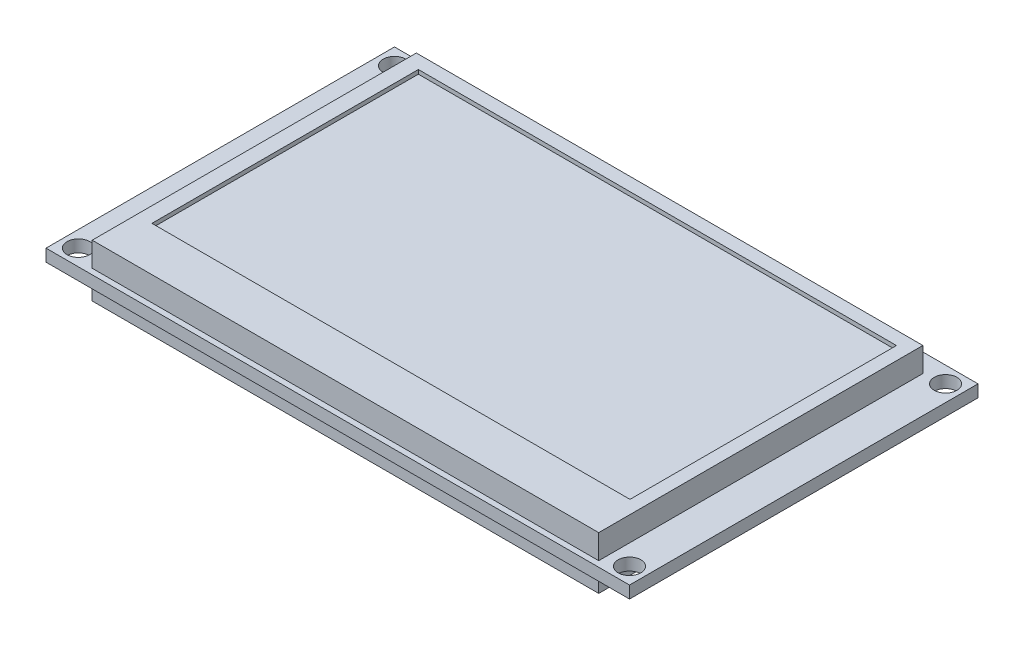
ISO-10303-21;
HEADER;
FILE_DESCRIPTION(('STEP AP214'),'2;1');
FILE_NAME('part.step','',(''),(''),'','','');
FILE_SCHEMA(('AUTOMOTIVE_DESIGN { 1 0 10303 214 1 1 1 1 }'));
ENDSEC;
DATA;
#1=APPLICATION_CONTEXT('core data for automotive mechanical design processes');
#2=APPLICATION_PROTOCOL_DEFINITION('international standard','automotive_design',2000,#1);
#3=PRODUCT_CONTEXT('',#1,'mechanical');
#4=PRODUCT('Part','Part','',(#3));
#5=PRODUCT_RELATED_PRODUCT_CATEGORY('part','',(#4));
#6=PRODUCT_DEFINITION_FORMATION('','',#4);
#7=PRODUCT_DEFINITION_CONTEXT('part definition',#1,'design');
#8=PRODUCT_DEFINITION('design','',#6,#7);
#9=PRODUCT_DEFINITION_SHAPE('','',#8);
#10=(LENGTH_UNIT() NAMED_UNIT(*) SI_UNIT(.MILLI.,.METRE.));
#11=(NAMED_UNIT(*) PLANE_ANGLE_UNIT() SI_UNIT($,.RADIAN.));
#12=(NAMED_UNIT(*) SI_UNIT($,.STERADIAN.) SOLID_ANGLE_UNIT());
#13=UNCERTAINTY_MEASURE_WITH_UNIT(LENGTH_MEASURE(1.E-05),#10,'distance_accuracy_value','');
#14=(GEOMETRIC_REPRESENTATION_CONTEXT(3) GLOBAL_UNCERTAINTY_ASSIGNED_CONTEXT((#13)) GLOBAL_UNIT_ASSIGNED_CONTEXT((#10,
#11,#12)) REPRESENTATION_CONTEXT('',''));
#15=CARTESIAN_POINT('',(0.,0.,0.));
#16=DIRECTION('',(0.,0.,1.));
#17=DIRECTION('',(1.,0.,0.));
#18=AXIS2_PLACEMENT_3D('',#15,#16,#17);
#19=CARTESIAN_POINT('',(0.,1.5,0.));
#20=DIRECTION('',(0.,-1.,0.));
#21=DIRECTION('',(0.,0.,-1.));
#22=AXIS2_PLACEMENT_3D('',#19,#20,#21);
#23=PLANE('',#22);
#24=DIRECTION('',(0.,0.,1.));
#25=VECTOR('',#24,1.);
#26=CARTESIAN_POINT('',(0.,1.5,0.));
#27=LINE('',#26,#25);
#28=CARTESIAN_POINT('',(0.,1.5,-43.));
#29=VERTEX_POINT('',#28);
#30=CARTESIAN_POINT('',(0.,1.5,0.));
#31=VERTEX_POINT('',#30);
#32=EDGE_CURVE('E317',#29,#31,#27,.T.);
#33=ORIENTED_EDGE('',*,*,#32,.T.);
#34=DIRECTION('',(1.,0.,0.));
#35=VECTOR('',#34,1.);
#36=CARTESIAN_POINT('',(0.,1.5,0.));
#37=LINE('',#36,#35);
#38=CARTESIAN_POINT('',(72.,1.5,0.));
#39=VERTEX_POINT('',#38);
#40=EDGE_CURVE('E321',#31,#39,#37,.T.);
#41=ORIENTED_EDGE('',*,*,#40,.T.);
#42=DIRECTION('',(0.,0.,-1.));
#43=VECTOR('',#42,1.);
#44=CARTESIAN_POINT('',(72.,1.5,0.));
#45=LINE('',#44,#43);
#46=CARTESIAN_POINT('',(72.,1.5,-43.));
#47=VERTEX_POINT('',#46);
#48=EDGE_CURVE('E325',#39,#47,#45,.T.);
#49=ORIENTED_EDGE('',*,*,#48,.T.);
#50=DIRECTION('',(-1.,0.,0.));
#51=VECTOR('',#50,1.);
#52=CARTESIAN_POINT('',(0.,1.5,-43.));
#53=LINE('',#52,#51);
#54=EDGE_CURVE('E328',#47,#29,#53,.T.);
#55=ORIENTED_EDGE('',*,*,#54,.T.);
#56=EDGE_LOOP('',(#33,#41,#49,#55));
#57=FACE_BOUND('',#56,.T.);
#58=CARTESIAN_POINT('',(2.,1.5,-41.));
#59=DIRECTION('',(0.,1.,0.));
#60=DIRECTION('',(0.,0.,1.));
#61=AXIS2_PLACEMENT_3D('',#58,#59,#60);
#62=CIRCLE('',#61,1.4);
#63=CARTESIAN_POINT('',(2.,1.5,-39.6));
#64=VERTEX_POINT('',#63);
#65=EDGE_CURVE('E297',#64,#64,#62,.T.);
#66=ORIENTED_EDGE('',*,*,#65,.F.);
#67=EDGE_LOOP('',(#66));
#68=FACE_BOUND('',#67,.T.);
#69=CARTESIAN_POINT('',(70.,1.5,-2.));
#70=DIRECTION('',(0.,1.,0.));
#71=DIRECTION('',(0.,0.,1.));
#72=AXIS2_PLACEMENT_3D('',#69,#70,#71);
#73=CIRCLE('',#72,1.4);
#74=CARTESIAN_POINT('',(70.,1.5,-0.599999999999997));
#75=VERTEX_POINT('',#74);
#76=EDGE_CURVE('E285',#75,#75,#73,.T.);
#77=ORIENTED_EDGE('',*,*,#76,.F.);
#78=EDGE_LOOP('',(#77));
#79=FACE_BOUND('',#78,.T.);
#80=CARTESIAN_POINT('',(2.,1.5,-2.));
#81=DIRECTION('',(0.,1.,0.));
#82=DIRECTION('',(0.,0.,1.));
#83=AXIS2_PLACEMENT_3D('',#80,#81,#82);
#84=CIRCLE('',#83,1.4);
#85=CARTESIAN_POINT('',(2.,1.5,-0.6));
#86=VERTEX_POINT('',#85);
#87=EDGE_CURVE('E302',#86,#86,#84,.T.);
#88=ORIENTED_EDGE('',*,*,#87,.F.);
#89=EDGE_LOOP('',(#88));
#90=FACE_BOUND('',#89,.T.);
#91=CARTESIAN_POINT('',(70.,1.5,-41.));
#92=DIRECTION('',(0.,1.,0.));
#93=DIRECTION('',(0.,0.,1.));
#94=AXIS2_PLACEMENT_3D('',#91,#92,#93);
#95=CIRCLE('',#94,1.4);
#96=CARTESIAN_POINT('',(70.,1.5,-39.6));
#97=VERTEX_POINT('',#96);
#98=EDGE_CURVE('E293',#97,#97,#95,.T.);
#99=ORIENTED_EDGE('',*,*,#98,.F.);
#100=EDGE_LOOP('',(#99));
#101=FACE_BOUND('',#100,.T.);
#102=DIRECTION('',(0.,0.,1.));
#103=VECTOR('',#102,1.);
#104=CARTESIAN_POINT('',(5.,1.5,-40.7));
#105=LINE('',#104,#103);
#106=CARTESIAN_POINT('',(5.,1.5,-40.7));
#107=VERTEX_POINT('',#106);
#108=CARTESIAN_POINT('',(5.00000000000001,1.5,-0.699999999999999));
#109=VERTEX_POINT('',#108);
#110=EDGE_CURVE('E228',#107,#109,#105,.T.);
#111=ORIENTED_EDGE('',*,*,#110,.F.);
#112=DIRECTION('',(-1.,0.,0.));
#113=VECTOR('',#112,1.);
#114=CARTESIAN_POINT('',(5.,1.5,-40.7));
#115=LINE('',#114,#113);
#116=CARTESIAN_POINT('',(67.5,1.5,-40.7));
#117=VERTEX_POINT('',#116);
#118=EDGE_CURVE('E245',#117,#107,#115,.T.);
#119=ORIENTED_EDGE('',*,*,#118,.F.);
#120=DIRECTION('',(0.,0.,-1.));
#121=VECTOR('',#120,1.);
#122=CARTESIAN_POINT('',(67.5,1.5,-40.7));
#123=LINE('',#122,#121);
#124=CARTESIAN_POINT('',(67.5,1.5,-0.699999999999999));
#125=VERTEX_POINT('',#124);
#126=EDGE_CURVE('E262',#125,#117,#123,.T.);
#127=ORIENTED_EDGE('',*,*,#126,.F.);
#128=DIRECTION('',(1.,0.,0.));
#129=VECTOR('',#128,1.);
#130=CARTESIAN_POINT('',(5.00000000000001,1.5,-0.699999999999999));
#131=LINE('',#130,#129);
#132=EDGE_CURVE('E258',#109,#125,#131,.T.);
#133=ORIENTED_EDGE('',*,*,#132,.F.);
#134=EDGE_LOOP('',(#111,#119,#127,#133));
#135=FACE_BOUND('',#134,.T.);
#136=ADVANCED_FACE('F45',(#57,#68,#79,#90,#101,#135),#23,.F.);
#137=CARTESIAN_POINT('',(0.,1.5,0.));
#138=DIRECTION('',(1.,0.,0.));
#139=DIRECTION('',(0.,0.,-1.));
#140=AXIS2_PLACEMENT_3D('',#137,#138,#139);
#141=PLANE('',#140);
#142=DIRECTION('',(0.,0.,1.));
#143=VECTOR('',#142,1.);
#144=CARTESIAN_POINT('',(0.,0.,0.));
#145=LINE('',#144,#143);
#146=CARTESIAN_POINT('',(0.,0.,-43.));
#147=VERTEX_POINT('',#146);
#148=CARTESIAN_POINT('',(0.,0.,0.));
#149=VERTEX_POINT('',#148);
#150=EDGE_CURVE('E313',#147,#149,#145,.T.);
#151=ORIENTED_EDGE('',*,*,#150,.T.);
#152=DIRECTION('',(0.,-1.,0.));
#153=VECTOR('',#152,1.);
#154=CARTESIAN_POINT('',(0.,1.5,0.));
#155=LINE('',#154,#153);
#156=EDGE_CURVE('E354',#31,#149,#155,.T.);
#157=ORIENTED_EDGE('',*,*,#156,.F.);
#158=ORIENTED_EDGE('',*,*,#32,.F.);
#159=DIRECTION('',(0.,-1.,0.));
#160=VECTOR('',#159,1.);
#161=CARTESIAN_POINT('',(0.,1.5,-43.));
#162=LINE('',#161,#160);
#163=EDGE_CURVE('E331',#29,#147,#162,.T.);
#164=ORIENTED_EDGE('',*,*,#163,.T.);
#165=EDGE_LOOP('',(#151,#157,#158,#164));
#166=FACE_BOUND('',#165,.T.);
#167=ADVANCED_FACE('F47',(#166),#141,.F.);
#168=CARTESIAN_POINT('',(0.,1.5,0.));
#169=DIRECTION('',(0.,0.,-1.));
#170=DIRECTION('',(-1.,0.,0.));
#171=AXIS2_PLACEMENT_3D('',#168,#169,#170);
#172=PLANE('',#171);
#173=DIRECTION('',(1.,0.,0.));
#174=VECTOR('',#173,1.);
#175=CARTESIAN_POINT('',(0.,0.,0.));
#176=LINE('',#175,#174);
#177=CARTESIAN_POINT('',(72.,0.,0.));
#178=VERTEX_POINT('',#177);
#179=EDGE_CURVE('E335',#149,#178,#176,.T.);
#180=ORIENTED_EDGE('',*,*,#179,.T.);
#181=DIRECTION('',(0.,-1.,0.));
#182=VECTOR('',#181,1.);
#183=CARTESIAN_POINT('',(72.,1.5,0.));
#184=LINE('',#183,#182);
#185=EDGE_CURVE('E350',#39,#178,#184,.T.);
#186=ORIENTED_EDGE('',*,*,#185,.F.);
#187=ORIENTED_EDGE('',*,*,#40,.F.);
#188=ORIENTED_EDGE('',*,*,#156,.T.);
#189=EDGE_LOOP('',(#180,#186,#187,#188));
#190=FACE_BOUND('',#189,.T.);
#191=ADVANCED_FACE('F399',(#190),#172,.F.);
#192=CARTESIAN_POINT('',(72.,1.5,0.));
#193=DIRECTION('',(-1.,0.,0.));
#194=DIRECTION('',(0.,0.,1.));
#195=AXIS2_PLACEMENT_3D('',#192,#193,#194);
#196=PLANE('',#195);
#197=DIRECTION('',(0.,0.,-1.));
#198=VECTOR('',#197,1.);
#199=CARTESIAN_POINT('',(72.,0.,0.));
#200=LINE('',#199,#198);
#201=CARTESIAN_POINT('',(72.,0.,-43.));
#202=VERTEX_POINT('',#201);
#203=EDGE_CURVE('E338',#178,#202,#200,.T.);
#204=ORIENTED_EDGE('',*,*,#203,.T.);
#205=DIRECTION('',(0.,-1.,0.));
#206=VECTOR('',#205,1.);
#207=CARTESIAN_POINT('',(72.,1.5,-43.));
#208=LINE('',#207,#206);
#209=EDGE_CURVE('E346',#47,#202,#208,.T.);
#210=ORIENTED_EDGE('',*,*,#209,.F.);
#211=ORIENTED_EDGE('',*,*,#48,.F.);
#212=ORIENTED_EDGE('',*,*,#185,.T.);
#213=EDGE_LOOP('',(#204,#210,#211,#212));
#214=FACE_BOUND('',#213,.T.);
#215=ADVANCED_FACE('F411',(#214),#196,.F.);
#216=CARTESIAN_POINT('',(0.,1.5,-43.));
#217=DIRECTION('',(0.,0.,1.));
#218=DIRECTION('',(1.,0.,0.));
#219=AXIS2_PLACEMENT_3D('',#216,#217,#218);
#220=PLANE('',#219);
#221=DIRECTION('',(-1.,0.,0.));
#222=VECTOR('',#221,1.);
#223=CARTESIAN_POINT('',(0.,0.,-43.));
#224=LINE('',#223,#222);
#225=EDGE_CURVE('E322',#202,#147,#224,.T.);
#226=ORIENTED_EDGE('',*,*,#225,.T.);
#227=ORIENTED_EDGE('',*,*,#163,.F.);
#228=ORIENTED_EDGE('',*,*,#54,.F.);
#229=ORIENTED_EDGE('',*,*,#209,.T.);
#230=EDGE_LOOP('',(#226,#227,#228,#229));
#231=FACE_BOUND('',#230,.T.);
#232=ADVANCED_FACE('F408',(#231),#220,.F.);
#233=CARTESIAN_POINT('',(0.,0.,0.));
#234=DIRECTION('',(0.,-1.,0.));
#235=DIRECTION('',(0.,0.,-1.));
#236=AXIS2_PLACEMENT_3D('',#233,#234,#235);
#237=PLANE('',#236);
#238=DIRECTION('',(0.,0.,-1.));
#239=VECTOR('',#238,1.);
#240=CARTESIAN_POINT('',(5.00000000000001,0.,0.));
#241=LINE('',#240,#239);
#242=CARTESIAN_POINT('',(5.00000000000001,0.,-0.699999999999999));
#243=VERTEX_POINT('',#242);
#244=CARTESIAN_POINT('',(5.,0.,-40.7));
#245=VERTEX_POINT('',#244);
#246=EDGE_CURVE('E11',#243,#245,#241,.T.);
#247=ORIENTED_EDGE('',*,*,#246,.F.);
#248=DIRECTION('',(-1.,0.,0.));
#249=VECTOR('',#248,1.);
#250=CARTESIAN_POINT('',(0.,0.,-0.699999999999999));
#251=LINE('',#250,#249);
#252=CARTESIAN_POINT('',(67.5,0.,-0.699999999999999));
#253=VERTEX_POINT('',#252);
#254=EDGE_CURVE('E358',#253,#243,#251,.T.);
#255=ORIENTED_EDGE('',*,*,#254,.F.);
#256=DIRECTION('',(0.,0.,1.));
#257=VECTOR('',#256,1.);
#258=CARTESIAN_POINT('',(67.5,0.,0.));
#259=LINE('',#258,#257);
#260=CARTESIAN_POINT('',(67.5,0.,-40.7));
#261=VERTEX_POINT('',#260);
#262=EDGE_CURVE('E362',#261,#253,#259,.T.);
#263=ORIENTED_EDGE('',*,*,#262,.F.);
#264=DIRECTION('',(1.,0.,0.));
#265=VECTOR('',#264,1.);
#266=CARTESIAN_POINT('',(0.,0.,-40.7));
#267=LINE('',#266,#265);
#268=EDGE_CURVE('E54',#245,#261,#267,.T.);
#269=ORIENTED_EDGE('',*,*,#268,.F.);
#270=EDGE_LOOP('',(#247,#255,#263,#269));
#271=FACE_BOUND('',#270,.T.);
#272=CARTESIAN_POINT('',(70.,0.,-41.));
#273=DIRECTION('',(0.,1.,0.));
#274=DIRECTION('',(0.,0.,1.));
#275=AXIS2_PLACEMENT_3D('',#272,#273,#274);
#276=CIRCLE('',#275,1.4);
#277=CARTESIAN_POINT('',(70.,0.,-39.6));
#278=VERTEX_POINT('',#277);
#279=EDGE_CURVE('E298',#278,#278,#276,.T.);
#280=ORIENTED_EDGE('',*,*,#279,.T.);
#281=EDGE_LOOP('',(#280));
#282=FACE_BOUND('',#281,.T.);
#283=CARTESIAN_POINT('',(2.,0.,-2.));
#284=DIRECTION('',(0.,1.,0.));
#285=DIRECTION('',(0.,0.,1.));
#286=AXIS2_PLACEMENT_3D('',#283,#284,#285);
#287=CIRCLE('',#286,1.4);
#288=CARTESIAN_POINT('',(2.,0.,-0.6));
#289=VERTEX_POINT('',#288);
#290=EDGE_CURVE('E289',#289,#289,#287,.T.);
#291=ORIENTED_EDGE('',*,*,#290,.T.);
#292=EDGE_LOOP('',(#291));
#293=FACE_BOUND('',#292,.T.);
#294=CARTESIAN_POINT('',(70.,0.,-2.));
#295=DIRECTION('',(0.,1.,0.));
#296=DIRECTION('',(0.,0.,1.));
#297=AXIS2_PLACEMENT_3D('',#294,#295,#296);
#298=CIRCLE('',#297,1.4);
#299=CARTESIAN_POINT('',(70.,0.,-0.599999999999997));
#300=VERTEX_POINT('',#299);
#301=EDGE_CURVE('E284',#300,#300,#298,.T.);
#302=ORIENTED_EDGE('',*,*,#301,.T.);
#303=EDGE_LOOP('',(#302));
#304=FACE_BOUND('',#303,.T.);
#305=CARTESIAN_POINT('',(2.,0.,-41.));
#306=DIRECTION('',(0.,1.,0.));
#307=DIRECTION('',(0.,0.,1.));
#308=AXIS2_PLACEMENT_3D('',#305,#306,#307);
#309=CIRCLE('',#308,1.4);
#310=CARTESIAN_POINT('',(2.,0.,-39.6));
#311=VERTEX_POINT('',#310);
#312=EDGE_CURVE('E309',#311,#311,#309,.T.);
#313=ORIENTED_EDGE('',*,*,#312,.T.);
#314=EDGE_LOOP('',(#313));
#315=FACE_BOUND('',#314,.T.);
#316=ORIENTED_EDGE('',*,*,#150,.F.);
#317=ORIENTED_EDGE('',*,*,#225,.F.);
#318=ORIENTED_EDGE('',*,*,#203,.F.);
#319=ORIENTED_EDGE('',*,*,#179,.F.);
#320=EDGE_LOOP('',(#316,#317,#318,#319));
#321=FACE_BOUND('',#320,.T.);
#322=ADVANCED_FACE('F378',(#271,#282,#293,#304,#315,#321),#237,.T.);
#323=CARTESIAN_POINT('',(2.,0.,-41.));
#324=DIRECTION('',(0.,1.,0.));
#325=DIRECTION('',(0.,0.,1.));
#326=AXIS2_PLACEMENT_3D('',#323,#324,#325);
#327=CYLINDRICAL_SURFACE('',#326,1.4);
#328=ORIENTED_EDGE('',*,*,#312,.F.);
#329=EDGE_LOOP('',(#328));
#330=FACE_BOUND('',#329,.T.);
#331=ORIENTED_EDGE('',*,*,#65,.T.);
#332=EDGE_LOOP('',(#331));
#333=FACE_BOUND('',#332,.T.);
#334=ADVANCED_FACE('F404',(#330,#333),#327,.F.);
#335=CARTESIAN_POINT('',(70.,0.,-2.));
#336=DIRECTION('',(0.,1.,0.));
#337=DIRECTION('',(0.,0.,1.));
#338=AXIS2_PLACEMENT_3D('',#335,#336,#337);
#339=CYLINDRICAL_SURFACE('',#338,1.4);
#340=ORIENTED_EDGE('',*,*,#301,.F.);
#341=EDGE_LOOP('',(#340));
#342=FACE_BOUND('',#341,.T.);
#343=ORIENTED_EDGE('',*,*,#76,.T.);
#344=EDGE_LOOP('',(#343));
#345=FACE_BOUND('',#344,.T.);
#346=ADVANCED_FACE('F450',(#342,#345),#339,.F.);
#347=CARTESIAN_POINT('',(2.,0.,-2.));
#348=DIRECTION('',(0.,1.,0.));
#349=DIRECTION('',(0.,0.,1.));
#350=AXIS2_PLACEMENT_3D('',#347,#348,#349);
#351=CYLINDRICAL_SURFACE('',#350,1.4);
#352=ORIENTED_EDGE('',*,*,#290,.F.);
#353=EDGE_LOOP('',(#352));
#354=FACE_BOUND('',#353,.T.);
#355=ORIENTED_EDGE('',*,*,#87,.T.);
#356=EDGE_LOOP('',(#355));
#357=FACE_BOUND('',#356,.T.);
#358=ADVANCED_FACE('F458',(#354,#357),#351,.F.);
#359=CARTESIAN_POINT('',(70.,0.,-41.));
#360=DIRECTION('',(0.,1.,0.));
#361=DIRECTION('',(0.,0.,1.));
#362=AXIS2_PLACEMENT_3D('',#359,#360,#361);
#363=CYLINDRICAL_SURFACE('',#362,1.4);
#364=ORIENTED_EDGE('',*,*,#279,.F.);
#365=EDGE_LOOP('',(#364));
#366=FACE_BOUND('',#365,.T.);
#367=ORIENTED_EDGE('',*,*,#98,.T.);
#368=EDGE_LOOP('',(#367));
#369=FACE_BOUND('',#368,.T.);
#370=ADVANCED_FACE('F466',(#366,#369),#363,.F.);
#371=CARTESIAN_POINT('',(5.,4.5,-40.7));
#372=DIRECTION('',(1.,0.,0.));
#373=DIRECTION('',(0.,0.,-1.));
#374=AXIS2_PLACEMENT_3D('',#371,#372,#373);
#375=PLANE('',#374);
#376=ORIENTED_EDGE('',*,*,#110,.T.);
#377=DIRECTION('',(0.,-1.,0.));
#378=VECTOR('',#377,1.);
#379=CARTESIAN_POINT('',(5.00000000000001,4.5,-0.699999999999999));
#380=LINE('',#379,#378);
#381=CARTESIAN_POINT('',(5.00000000000001,4.5,-0.699999999999999));
#382=VERTEX_POINT('',#381);
#383=EDGE_CURVE('E280',#382,#109,#380,.T.);
#384=ORIENTED_EDGE('',*,*,#383,.F.);
#385=DIRECTION('',(0.,0.,1.));
#386=VECTOR('',#385,1.);
#387=CARTESIAN_POINT('',(5.,4.5,-40.7));
#388=LINE('',#387,#386);
#389=CARTESIAN_POINT('',(5.,4.5,-40.7));
#390=VERTEX_POINT('',#389);
#391=EDGE_CURVE('E240',#390,#382,#388,.T.);
#392=ORIENTED_EDGE('',*,*,#391,.F.);
#393=DIRECTION('',(0.,-1.,0.));
#394=VECTOR('',#393,1.);
#395=CARTESIAN_POINT('',(5.,4.5,-40.7));
#396=LINE('',#395,#394);
#397=EDGE_CURVE('E254',#390,#107,#396,.T.);
#398=ORIENTED_EDGE('',*,*,#397,.T.);
#399=EDGE_LOOP('',(#376,#384,#392,#398));
#400=FACE_BOUND('',#399,.T.);
#401=ADVANCED_FACE('F473',(#400),#375,.F.);
#402=CARTESIAN_POINT('',(5.00000000000001,4.5,-0.699999999999999));
#403=DIRECTION('',(0.,0.,-1.));
#404=DIRECTION('',(-1.,0.,0.));
#405=AXIS2_PLACEMENT_3D('',#402,#403,#404);
#406=PLANE('',#405);
#407=ORIENTED_EDGE('',*,*,#132,.T.);
#408=DIRECTION('',(0.,-1.,0.));
#409=VECTOR('',#408,1.);
#410=CARTESIAN_POINT('',(67.5,4.5,-0.699999999999999));
#411=LINE('',#410,#409);
#412=CARTESIAN_POINT('',(67.5,4.5,-0.699999999999999));
#413=VERTEX_POINT('',#412);
#414=EDGE_CURVE('E276',#413,#125,#411,.T.);
#415=ORIENTED_EDGE('',*,*,#414,.F.);
#416=DIRECTION('',(1.,0.,0.));
#417=VECTOR('',#416,1.);
#418=CARTESIAN_POINT('',(5.00000000000001,4.5,-0.699999999999999));
#419=LINE('',#418,#417);
#420=EDGE_CURVE('E244',#382,#413,#419,.T.);
#421=ORIENTED_EDGE('',*,*,#420,.F.);
#422=ORIENTED_EDGE('',*,*,#383,.T.);
#423=EDGE_LOOP('',(#407,#415,#421,#422));
#424=FACE_BOUND('',#423,.T.);
#425=ADVANCED_FACE('F489',(#424),#406,.F.);
#426=CARTESIAN_POINT('',(67.5,4.5,-40.7));
#427=DIRECTION('',(-1.,0.,0.));
#428=DIRECTION('',(0.,0.,1.));
#429=AXIS2_PLACEMENT_3D('',#426,#427,#428);
#430=PLANE('',#429);
#431=ORIENTED_EDGE('',*,*,#126,.T.);
#432=DIRECTION('',(0.,-1.,0.));
#433=VECTOR('',#432,1.);
#434=CARTESIAN_POINT('',(67.5,4.5,-40.7));
#435=LINE('',#434,#433);
#436=CARTESIAN_POINT('',(67.5,4.5,-40.7));
#437=VERTEX_POINT('',#436);
#438=EDGE_CURVE('E272',#437,#117,#435,.T.);
#439=ORIENTED_EDGE('',*,*,#438,.F.);
#440=DIRECTION('',(0.,0.,-1.));
#441=VECTOR('',#440,1.);
#442=CARTESIAN_POINT('',(67.5,4.5,-40.7));
#443=LINE('',#442,#441);
#444=EDGE_CURVE('E248',#413,#437,#443,.T.);
#445=ORIENTED_EDGE('',*,*,#444,.F.);
#446=ORIENTED_EDGE('',*,*,#414,.T.);
#447=EDGE_LOOP('',(#431,#439,#445,#446));
#448=FACE_BOUND('',#447,.T.);
#449=ADVANCED_FACE('F499',(#448),#430,.F.);
#450=CARTESIAN_POINT('',(5.,4.5,-40.7));
#451=DIRECTION('',(0.,0.,1.));
#452=DIRECTION('',(1.,0.,0.));
#453=AXIS2_PLACEMENT_3D('',#450,#451,#452);
#454=PLANE('',#453);
#455=ORIENTED_EDGE('',*,*,#118,.T.);
#456=ORIENTED_EDGE('',*,*,#397,.F.);
#457=DIRECTION('',(-1.,0.,0.));
#458=VECTOR('',#457,1.);
#459=CARTESIAN_POINT('',(5.,4.5,-40.7));
#460=LINE('',#459,#458);
#461=EDGE_CURVE('E251',#437,#390,#460,.T.);
#462=ORIENTED_EDGE('',*,*,#461,.F.);
#463=ORIENTED_EDGE('',*,*,#438,.T.);
#464=EDGE_LOOP('',(#455,#456,#462,#463));
#465=FACE_BOUND('',#464,.T.);
#466=ADVANCED_FACE('F509',(#465),#454,.F.);
#467=CARTESIAN_POINT('',(0.,4.5,0.));
#468=DIRECTION('',(0.,1.,0.));
#469=DIRECTION('',(0.,0.,1.));
#470=AXIS2_PLACEMENT_3D('',#467,#468,#469);
#471=PLANE('',#470);
#472=DIRECTION('',(0.,0.,1.));
#473=VECTOR('',#472,1.);
#474=CARTESIAN_POINT('',(6.8850404711753,4.5,-39.0622264773516));
#475=LINE('',#474,#473);
#476=CARTESIAN_POINT('',(6.8850404711753,4.5,-39.0622264773516));
#477=VERTEX_POINT('',#476);
#478=CARTESIAN_POINT('',(6.8850404711753,4.5,-6.182699227718));
#479=VERTEX_POINT('',#478);
#480=EDGE_CURVE('E61',#477,#479,#475,.T.);
#481=ORIENTED_EDGE('',*,*,#480,.F.);
#482=DIRECTION('',(-1.,0.,0.));
#483=VECTOR('',#482,1.);
#484=CARTESIAN_POINT('',(6.8850404711753,4.5,-39.0622264773516));
#485=LINE('',#484,#483);
#486=CARTESIAN_POINT('',(65.8747805366944,4.5,-39.0622264773516));
#487=VERTEX_POINT('',#486);
#488=EDGE_CURVE('E180',#487,#477,#485,.T.);
#489=ORIENTED_EDGE('',*,*,#488,.F.);
#490=DIRECTION('',(0.,0.,-1.));
#491=VECTOR('',#490,1.);
#492=CARTESIAN_POINT('',(65.8747805366944,4.5,-39.0622264773516));
#493=LINE('',#492,#491);
#494=CARTESIAN_POINT('',(65.8747805366944,4.5,-6.182699227718));
#495=VERTEX_POINT('',#494);
#496=EDGE_CURVE('E184',#495,#487,#493,.T.);
#497=ORIENTED_EDGE('',*,*,#496,.F.);
#498=DIRECTION('',(1.,0.,0.));
#499=VECTOR('',#498,1.);
#500=CARTESIAN_POINT('',(6.8850404711753,4.5,-6.182699227718));
#501=LINE('',#500,#499);
#502=EDGE_CURVE('E193',#479,#495,#501,.T.);
#503=ORIENTED_EDGE('',*,*,#502,.F.);
#504=EDGE_LOOP('',(#481,#489,#497,#503));
#505=FACE_BOUND('',#504,.T.);
#506=ORIENTED_EDGE('',*,*,#391,.T.);
#507=ORIENTED_EDGE('',*,*,#420,.T.);
#508=ORIENTED_EDGE('',*,*,#444,.T.);
#509=ORIENTED_EDGE('',*,*,#461,.T.);
#510=EDGE_LOOP('',(#506,#507,#508,#509));
#511=FACE_BOUND('',#510,.T.);
#512=ADVANCED_FACE('F519',(#505,#511),#471,.T.);
#513=CARTESIAN_POINT('',(5.,-2.,-40.7));
#514=DIRECTION('',(-1.,0.,0.));
#515=DIRECTION('',(0.,0.,1.));
#516=AXIS2_PLACEMENT_3D('',#513,#514,#515);
#517=PLANE('',#516);
#518=DIRECTION('',(0.,1.,0.));
#519=VECTOR('',#518,1.);
#520=CARTESIAN_POINT('',(5.00000000000001,-2.,-0.699999999999999));
#521=LINE('',#520,#519);
#522=CARTESIAN_POINT('',(5.00000000000001,-2.,-0.699999999999999));
#523=VERTEX_POINT('',#522);
#524=EDGE_CURVE('E223',#523,#243,#521,.T.);
#525=ORIENTED_EDGE('',*,*,#524,.T.);
#526=ORIENTED_EDGE('',*,*,#246,.T.);
#527=DIRECTION('',(0.,1.,0.));
#528=VECTOR('',#527,1.);
#529=CARTESIAN_POINT('',(5.,-2.,-40.7));
#530=LINE('',#529,#528);
#531=CARTESIAN_POINT('',(5.,-2.,-40.7));
#532=VERTEX_POINT('',#531);
#533=EDGE_CURVE('E224',#532,#245,#530,.T.);
#534=ORIENTED_EDGE('',*,*,#533,.F.);
#535=DIRECTION('',(0.,0.,1.));
#536=VECTOR('',#535,1.);
#537=CARTESIAN_POINT('',(5.,-2.,-40.7));
#538=LINE('',#537,#536);
#539=EDGE_CURVE('E202',#532,#523,#538,.T.);
#540=ORIENTED_EDGE('',*,*,#539,.T.);
#541=EDGE_LOOP('',(#525,#526,#534,#540));
#542=FACE_BOUND('',#541,.T.);
#543=ADVANCED_FACE('F377',(#542),#517,.T.);
#544=CARTESIAN_POINT('',(5.,-2.,-40.7));
#545=DIRECTION('',(0.,0.,-1.));
#546=DIRECTION('',(-1.,0.,0.));
#547=AXIS2_PLACEMENT_3D('',#544,#545,#546);
#548=PLANE('',#547);
#549=ORIENTED_EDGE('',*,*,#533,.T.);
#550=ORIENTED_EDGE('',*,*,#268,.T.);
#551=DIRECTION('',(0.,1.,0.));
#552=VECTOR('',#551,1.);
#553=CARTESIAN_POINT('',(67.5,-2.,-40.7));
#554=LINE('',#553,#552);
#555=CARTESIAN_POINT('',(67.5,-2.,-40.7));
#556=VERTEX_POINT('',#555);
#557=EDGE_CURVE('E229',#556,#261,#554,.T.);
#558=ORIENTED_EDGE('',*,*,#557,.F.);
#559=DIRECTION('',(-1.,0.,0.));
#560=VECTOR('',#559,1.);
#561=CARTESIAN_POINT('',(5.,-2.,-40.7));
#562=LINE('',#561,#560);
#563=EDGE_CURVE('E219',#556,#532,#562,.T.);
#564=ORIENTED_EDGE('',*,*,#563,.T.);
#565=EDGE_LOOP('',(#549,#550,#558,#564));
#566=FACE_BOUND('',#565,.T.);
#567=ADVANCED_FACE('F367',(#566),#548,.T.);
#568=CARTESIAN_POINT('',(67.5,-2.,-40.7));
#569=DIRECTION('',(1.,0.,0.));
#570=DIRECTION('',(0.,0.,-1.));
#571=AXIS2_PLACEMENT_3D('',#568,#569,#570);
#572=PLANE('',#571);
#573=ORIENTED_EDGE('',*,*,#557,.T.);
#574=ORIENTED_EDGE('',*,*,#262,.T.);
#575=DIRECTION('',(0.,1.,0.));
#576=VECTOR('',#575,1.);
#577=CARTESIAN_POINT('',(67.5,-2.,-0.699999999999999));
#578=LINE('',#577,#576);
#579=CARTESIAN_POINT('',(67.5,-2.,-0.699999999999999));
#580=VERTEX_POINT('',#579);
#581=EDGE_CURVE('E233',#580,#253,#578,.T.);
#582=ORIENTED_EDGE('',*,*,#581,.F.);
#583=DIRECTION('',(0.,0.,-1.));
#584=VECTOR('',#583,1.);
#585=CARTESIAN_POINT('',(67.5,-2.,-40.7));
#586=LINE('',#585,#584);
#587=EDGE_CURVE('E215',#580,#556,#586,.T.);
#588=ORIENTED_EDGE('',*,*,#587,.T.);
#589=EDGE_LOOP('',(#573,#574,#582,#588));
#590=FACE_BOUND('',#589,.T.);
#591=ADVANCED_FACE('F369',(#590),#572,.T.);
#592=CARTESIAN_POINT('',(5.00000000000001,-2.,-0.699999999999999));
#593=DIRECTION('',(0.,0.,1.));
#594=DIRECTION('',(1.,0.,0.));
#595=AXIS2_PLACEMENT_3D('',#592,#593,#594);
#596=PLANE('',#595);
#597=ORIENTED_EDGE('',*,*,#581,.T.);
#598=ORIENTED_EDGE('',*,*,#254,.T.);
#599=ORIENTED_EDGE('',*,*,#524,.F.);
#600=DIRECTION('',(1.,0.,0.));
#601=VECTOR('',#600,1.);
#602=CARTESIAN_POINT('',(5.00000000000001,-2.,-0.699999999999999));
#603=LINE('',#602,#601);
#604=EDGE_CURVE('E211',#523,#580,#603,.T.);
#605=ORIENTED_EDGE('',*,*,#604,.T.);
#606=EDGE_LOOP('',(#597,#598,#599,#605));
#607=FACE_BOUND('',#606,.T.);
#608=ADVANCED_FACE('F381',(#607),#596,.T.);
#609=CARTESIAN_POINT('',(0.,-2.,0.));
#610=DIRECTION('',(0.,1.,0.));
#611=DIRECTION('',(0.,0.,1.));
#612=AXIS2_PLACEMENT_3D('',#609,#610,#611);
#613=PLANE('',#612);
#614=ORIENTED_EDGE('',*,*,#539,.F.);
#615=ORIENTED_EDGE('',*,*,#563,.F.);
#616=ORIENTED_EDGE('',*,*,#587,.F.);
#617=ORIENTED_EDGE('',*,*,#604,.F.);
#618=EDGE_LOOP('',(#614,#615,#616,#617));
#619=FACE_BOUND('',#618,.T.);
#620=ADVANCED_FACE('F375',(#619),#613,.F.);
#621=CARTESIAN_POINT('',(6.8850404711753,4.,-39.0622264773516));
#622=DIRECTION('',(-1.,0.,0.));
#623=DIRECTION('',(0.,0.,1.));
#624=AXIS2_PLACEMENT_3D('',#621,#622,#623);
#625=PLANE('',#624);
#626=ORIENTED_EDGE('',*,*,#480,.T.);
#627=DIRECTION('',(0.,1.,0.));
#628=VECTOR('',#627,1.);
#629=CARTESIAN_POINT('',(6.8850404711753,4.,-6.182699227718));
#630=LINE('',#629,#628);
#631=CARTESIAN_POINT('',(6.8850404711753,4.,-6.182699227718));
#632=VERTEX_POINT('',#631);
#633=EDGE_CURVE('E155',#632,#479,#630,.T.);
#634=ORIENTED_EDGE('',*,*,#633,.F.);
#635=DIRECTION('',(0.,0.,1.));
#636=VECTOR('',#635,1.);
#637=CARTESIAN_POINT('',(6.8850404711753,4.,-39.0622264773516));
#638=LINE('',#637,#636);
#639=CARTESIAN_POINT('',(6.8850404711753,4.,-39.0622264773516));
#640=VERTEX_POINT('',#639);
#641=EDGE_CURVE('E159',#640,#632,#638,.T.);
#642=ORIENTED_EDGE('',*,*,#641,.F.);
#643=DIRECTION('',(0.,1.,0.));
#644=VECTOR('',#643,1.);
#645=CARTESIAN_POINT('',(6.8850404711753,4.,-39.0622264773516));
#646=LINE('',#645,#644);
#647=EDGE_CURVE('E199',#640,#477,#646,.T.);
#648=ORIENTED_EDGE('',*,*,#647,.T.);
#649=EDGE_LOOP('',(#626,#634,#642,#648));
#650=FACE_BOUND('',#649,.T.);
#651=ADVANCED_FACE('F157',(#650),#625,.F.);
#652=CARTESIAN_POINT('',(6.8850404711753,4.,-39.0622264773516));
#653=DIRECTION('',(0.,0.,-1.));
#654=DIRECTION('',(-1.,0.,0.));
#655=AXIS2_PLACEMENT_3D('',#652,#653,#654);
#656=PLANE('',#655);
#657=ORIENTED_EDGE('',*,*,#488,.T.);
#658=ORIENTED_EDGE('',*,*,#647,.F.);
#659=DIRECTION('',(-1.,0.,0.));
#660=VECTOR('',#659,1.);
#661=CARTESIAN_POINT('',(6.8850404711753,4.,-39.0622264773516));
#662=LINE('',#661,#660);
#663=CARTESIAN_POINT('',(65.8747805366944,4.,-39.0622264773516));
#664=VERTEX_POINT('',#663);
#665=EDGE_CURVE('E166',#664,#640,#662,.T.);
#666=ORIENTED_EDGE('',*,*,#665,.F.);
#667=DIRECTION('',(0.,1.,0.));
#668=VECTOR('',#667,1.);
#669=CARTESIAN_POINT('',(65.8747805366944,4.,-39.0622264773516));
#670=LINE('',#669,#668);
#671=EDGE_CURVE('E203',#664,#487,#670,.T.);
#672=ORIENTED_EDGE('',*,*,#671,.T.);
#673=EDGE_LOOP('',(#657,#658,#666,#672));
#674=FACE_BOUND('',#673,.T.);
#675=ADVANCED_FACE('F569',(#674),#656,.F.);
#676=CARTESIAN_POINT('',(65.8747805366944,4.,-39.0622264773516));
#677=DIRECTION('',(1.,0.,0.));
#678=DIRECTION('',(0.,0.,-1.));
#679=AXIS2_PLACEMENT_3D('',#676,#677,#678);
#680=PLANE('',#679);
#681=ORIENTED_EDGE('',*,*,#496,.T.);
#682=ORIENTED_EDGE('',*,*,#671,.F.);
#683=DIRECTION('',(0.,0.,-1.));
#684=VECTOR('',#683,1.);
#685=CARTESIAN_POINT('',(65.8747805366944,4.,-39.0622264773516));
#686=LINE('',#685,#684);
#687=CARTESIAN_POINT('',(65.8747805366944,4.,-6.182699227718));
#688=VERTEX_POINT('',#687);
#689=EDGE_CURVE('E175',#688,#664,#686,.T.);
#690=ORIENTED_EDGE('',*,*,#689,.F.);
#691=DIRECTION('',(0.,1.,0.));
#692=VECTOR('',#691,1.);
#693=CARTESIAN_POINT('',(65.8747805366944,4.,-6.182699227718));
#694=LINE('',#693,#692);
#695=EDGE_CURVE('E165',#688,#495,#694,.T.);
#696=ORIENTED_EDGE('',*,*,#695,.T.);
#697=EDGE_LOOP('',(#681,#682,#690,#696));
#698=FACE_BOUND('',#697,.T.);
#699=ADVANCED_FACE('F578',(#698),#680,.F.);
#700=CARTESIAN_POINT('',(6.8850404711753,4.,-6.182699227718));
#701=DIRECTION('',(0.,0.,1.));
#702=DIRECTION('',(1.,0.,0.));
#703=AXIS2_PLACEMENT_3D('',#700,#701,#702);
#704=PLANE('',#703);
#705=ORIENTED_EDGE('',*,*,#502,.T.);
#706=ORIENTED_EDGE('',*,*,#695,.F.);
#707=DIRECTION('',(1.,0.,0.));
#708=VECTOR('',#707,1.);
#709=CARTESIAN_POINT('',(6.8850404711753,4.,-6.182699227718));
#710=LINE('',#709,#708);
#711=EDGE_CURVE('E169',#632,#688,#710,.T.);
#712=ORIENTED_EDGE('',*,*,#711,.F.);
#713=ORIENTED_EDGE('',*,*,#633,.T.);
#714=EDGE_LOOP('',(#705,#706,#712,#713));
#715=FACE_BOUND('',#714,.T.);
#716=ADVANCED_FACE('F170',(#715),#704,.F.);
#717=CARTESIAN_POINT('',(0.,4.,0.));
#718=DIRECTION('',(0.,1.,0.));
#719=DIRECTION('',(0.,0.,1.));
#720=AXIS2_PLACEMENT_3D('',#717,#718,#719);
#721=PLANE('',#720);
#722=ORIENTED_EDGE('',*,*,#641,.T.);
#723=ORIENTED_EDGE('',*,*,#711,.T.);
#724=ORIENTED_EDGE('',*,*,#689,.T.);
#725=ORIENTED_EDGE('',*,*,#665,.T.);
#726=EDGE_LOOP('',(#722,#723,#724,#725));
#727=FACE_BOUND('',#726,.T.);
#728=ADVANCED_FACE('F177',(#727),#721,.T.);
#729=CLOSED_SHELL('',(#136,#167,#191,#215,#232,#322,#334,#346,#358,#370,#401,#425,#449,#466,
#512,#543,#567,#591,#608,#620,#651,#675,#699,#716,#728));
#730=MANIFOLD_SOLID_BREP('B2',#729);
#731=ADVANCED_BREP_SHAPE_REPRESENTATION('',(#18,#730),#14);
#732=SHAPE_DEFINITION_REPRESENTATION(#9,#731);
ENDSEC;
END-ISO-10303-21;
